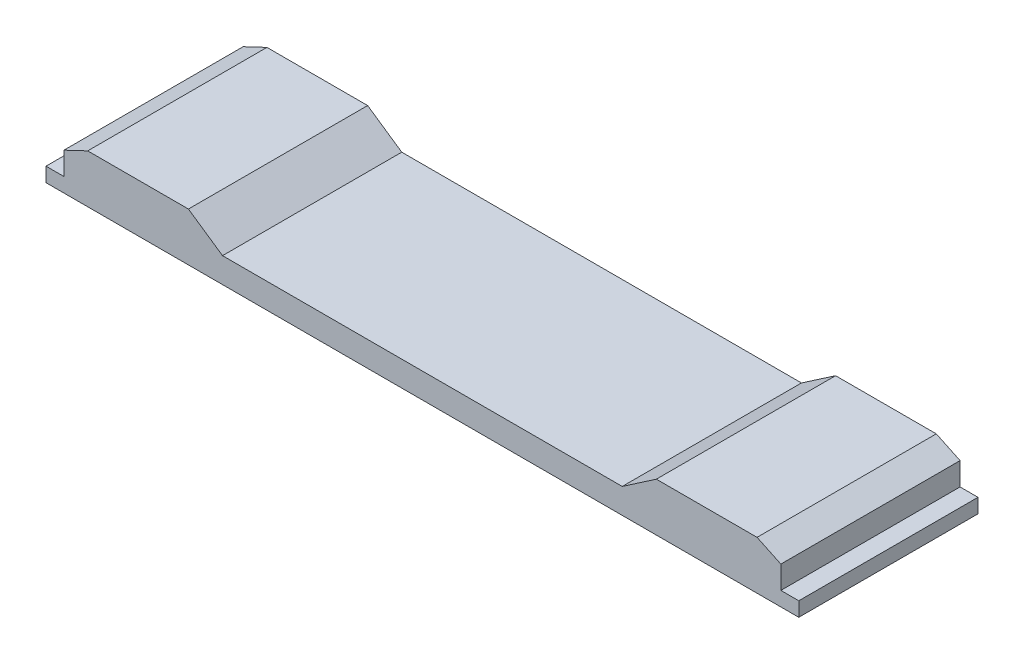
ISO-10303-21;
HEADER;
FILE_DESCRIPTION(('STEP AP214'),'2;1');
FILE_NAME('part.step','',(''),(''),'','','');
FILE_SCHEMA(('AUTOMOTIVE_DESIGN { 1 0 10303 214 1 1 1 1 }'));
ENDSEC;
DATA;
#1=APPLICATION_CONTEXT('core data for automotive mechanical design processes');
#2=APPLICATION_PROTOCOL_DEFINITION('international standard','automotive_design',2000,#1);
#3=PRODUCT_CONTEXT('',#1,'mechanical');
#4=PRODUCT('Part','Part','',(#3));
#5=PRODUCT_RELATED_PRODUCT_CATEGORY('part','',(#4));
#6=PRODUCT_DEFINITION_FORMATION('','',#4);
#7=PRODUCT_DEFINITION_CONTEXT('part definition',#1,'design');
#8=PRODUCT_DEFINITION('design','',#6,#7);
#9=PRODUCT_DEFINITION_SHAPE('','',#8);
#10=(LENGTH_UNIT() NAMED_UNIT(*) SI_UNIT(.MILLI.,.METRE.));
#11=(NAMED_UNIT(*) PLANE_ANGLE_UNIT() SI_UNIT($,.RADIAN.));
#12=(NAMED_UNIT(*) SI_UNIT($,.STERADIAN.) SOLID_ANGLE_UNIT());
#13=UNCERTAINTY_MEASURE_WITH_UNIT(LENGTH_MEASURE(1.E-05),#10,'distance_accuracy_value','');
#14=(GEOMETRIC_REPRESENTATION_CONTEXT(3) GLOBAL_UNCERTAINTY_ASSIGNED_CONTEXT((#13)) GLOBAL_UNIT_ASSIGNED_CONTEXT((#10,
#11,#12)) REPRESENTATION_CONTEXT('',''));
#15=CARTESIAN_POINT('',(0.,0.,0.));
#16=DIRECTION('',(0.,0.,1.));
#17=DIRECTION('',(1.,0.,0.));
#18=AXIS2_PLACEMENT_3D('',#15,#16,#17);
#19=CARTESIAN_POINT('',(21.,26.3300000000003,10.));
#20=DIRECTION('',(-1.,0.,0.));
#21=DIRECTION('',(0.,-1.,0.));
#22=AXIS2_PLACEMENT_3D('',#19,#20,#21);
#23=PLANE('',#22);
#24=DIRECTION('',(0.,1.,0.));
#25=VECTOR('',#24,1.);
#26=CARTESIAN_POINT('',(21.,26.3300000000003,0.));
#27=LINE('',#26,#25);
#28=CARTESIAN_POINT('',(21.,26.3300000000003,0.));
#29=VERTEX_POINT('',#28);
#30=CARTESIAN_POINT('',(21.,27.1300000000003,0.));
#31=VERTEX_POINT('',#30);
#32=EDGE_CURVE('E167',#29,#31,#27,.T.);
#33=ORIENTED_EDGE('',*,*,#32,.T.);
#34=DIRECTION('',(0.,0.,-1.));
#35=VECTOR('',#34,1.);
#36=CARTESIAN_POINT('',(21.,27.1300000000003,10.));
#37=LINE('',#36,#35);
#38=CARTESIAN_POINT('',(21.,27.1300000000003,10.));
#39=VERTEX_POINT('',#38);
#40=EDGE_CURVE('E11',#39,#31,#37,.T.);
#41=ORIENTED_EDGE('',*,*,#40,.F.);
#42=DIRECTION('',(0.,1.,0.));
#43=VECTOR('',#42,1.);
#44=CARTESIAN_POINT('',(21.,26.3300000000003,10.));
#45=LINE('',#44,#43);
#46=CARTESIAN_POINT('',(21.,26.3300000000003,10.));
#47=VERTEX_POINT('',#46);
#48=EDGE_CURVE('E194',#47,#39,#45,.T.);
#49=ORIENTED_EDGE('',*,*,#48,.F.);
#50=DIRECTION('',(0.,0.,-1.));
#51=VECTOR('',#50,1.);
#52=CARTESIAN_POINT('',(21.,26.3300000000003,10.));
#53=LINE('',#52,#51);
#54=EDGE_CURVE('E163',#47,#29,#53,.T.);
#55=ORIENTED_EDGE('',*,*,#54,.T.);
#56=EDGE_LOOP('',(#33,#41,#49,#55));
#57=FACE_BOUND('',#56,.T.);
#58=ADVANCED_FACE('F34',(#57),#23,.F.);
#59=CARTESIAN_POINT('',(20.,27.1300000000004,10.));
#60=DIRECTION('',(0.,-1.,0.));
#61=DIRECTION('',(1.,0.,0.));
#62=AXIS2_PLACEMENT_3D('',#59,#60,#61);
#63=PLANE('',#62);
#64=DIRECTION('',(-1.,0.,0.));
#65=VECTOR('',#64,1.);
#66=CARTESIAN_POINT('',(20.,27.1300000000004,0.));
#67=LINE('',#66,#65);
#68=CARTESIAN_POINT('',(20.,27.1300000000004,0.));
#69=VERTEX_POINT('',#68);
#70=EDGE_CURVE('E170',#31,#69,#67,.T.);
#71=ORIENTED_EDGE('',*,*,#70,.T.);
#72=DIRECTION('',(0.,0.,-1.));
#73=VECTOR('',#72,1.);
#74=CARTESIAN_POINT('',(20.,27.1300000000004,10.));
#75=LINE('',#74,#73);
#76=CARTESIAN_POINT('',(20.,27.1300000000004,10.));
#77=VERTEX_POINT('',#76);
#78=EDGE_CURVE('E42',#77,#69,#75,.T.);
#79=ORIENTED_EDGE('',*,*,#78,.F.);
#80=DIRECTION('',(-1.,0.,0.));
#81=VECTOR('',#80,1.);
#82=CARTESIAN_POINT('',(20.,27.1300000000004,10.));
#83=LINE('',#82,#81);
#84=EDGE_CURVE('E109',#39,#77,#83,.T.);
#85=ORIENTED_EDGE('',*,*,#84,.F.);
#86=ORIENTED_EDGE('',*,*,#40,.T.);
#87=EDGE_LOOP('',(#71,#79,#85,#86));
#88=FACE_BOUND('',#87,.T.);
#89=ADVANCED_FACE('F272',(#88),#63,.F.);
#90=CARTESIAN_POINT('',(20.,27.1300000000004,10.));
#91=DIRECTION('',(-1.,0.,0.));
#92=DIRECTION('',(0.,-1.,0.));
#93=AXIS2_PLACEMENT_3D('',#90,#91,#92);
#94=PLANE('',#93);
#95=DIRECTION('',(0.,1.,0.));
#96=VECTOR('',#95,1.);
#97=CARTESIAN_POINT('',(20.,27.1300000000004,0.));
#98=LINE('',#97,#96);
#99=CARTESIAN_POINT('',(20.,28.4029973447382,0.));
#100=VERTEX_POINT('',#99);
#101=EDGE_CURVE('E172',#69,#100,#98,.T.);
#102=ORIENTED_EDGE('',*,*,#101,.T.);
#103=DIRECTION('',(0.,0.,-1.));
#104=VECTOR('',#103,1.);
#105=CARTESIAN_POINT('',(20.,28.4029973447382,10.));
#106=LINE('',#105,#104);
#107=CARTESIAN_POINT('',(20.,28.4029973447382,10.));
#108=VERTEX_POINT('',#107);
#109=EDGE_CURVE('E219',#108,#100,#106,.T.);
#110=ORIENTED_EDGE('',*,*,#109,.F.);
#111=DIRECTION('',(0.,1.,0.));
#112=VECTOR('',#111,1.);
#113=CARTESIAN_POINT('',(20.,27.1300000000004,10.));
#114=LINE('',#113,#112);
#115=EDGE_CURVE('E227',#77,#108,#114,.T.);
#116=ORIENTED_EDGE('',*,*,#115,.F.);
#117=ORIENTED_EDGE('',*,*,#78,.T.);
#118=EDGE_LOOP('',(#102,#110,#116,#117));
#119=FACE_BOUND('',#118,.T.);
#120=ADVANCED_FACE('F225',(#119),#94,.F.);
#121=CARTESIAN_POINT('',(18.673455449261,29.0320391081246,10.));
#122=DIRECTION('',(-0.428463796767612,-0.903558949299647,0.));
#123=DIRECTION('',(0.903558949299647,-0.428463796767612,0.));
#124=AXIS2_PLACEMENT_3D('',#121,#122,#123);
#125=PLANE('',#124);
#126=DIRECTION('',(-0.903558949299647,0.428463796767612,0.));
#127=VECTOR('',#126,1.);
#128=CARTESIAN_POINT('',(18.673455449261,29.0320391081246,0.));
#129=LINE('',#128,#127);
#130=CARTESIAN_POINT('',(18.673455449261,29.0320391081246,0.));
#131=VERTEX_POINT('',#130);
#132=EDGE_CURVE('E174',#100,#131,#129,.T.);
#133=ORIENTED_EDGE('',*,*,#132,.T.);
#134=DIRECTION('',(0.,0.,-1.));
#135=VECTOR('',#134,1.);
#136=CARTESIAN_POINT('',(18.673455449261,29.0320391081246,10.));
#137=LINE('',#136,#135);
#138=CARTESIAN_POINT('',(18.673455449261,29.0320391081246,10.));
#139=VERTEX_POINT('',#138);
#140=EDGE_CURVE('E216',#139,#131,#137,.T.);
#141=ORIENTED_EDGE('',*,*,#140,.F.);
#142=DIRECTION('',(-0.903558949299647,0.428463796767612,0.));
#143=VECTOR('',#142,1.);
#144=CARTESIAN_POINT('',(18.673455449261,29.0320391081246,10.));
#145=LINE('',#144,#143);
#146=EDGE_CURVE('E243',#108,#139,#145,.T.);
#147=ORIENTED_EDGE('',*,*,#146,.F.);
#148=ORIENTED_EDGE('',*,*,#109,.T.);
#149=EDGE_LOOP('',(#133,#141,#147,#148));
#150=FACE_BOUND('',#149,.T.);
#151=ADVANCED_FACE('F234',(#150),#125,.F.);
#152=CARTESIAN_POINT('',(13.0537408112336,29.0320391081246,10.));
#153=DIRECTION('',(0.,-1.,0.));
#154=DIRECTION('',(0.,0.,-1.));
#155=AXIS2_PLACEMENT_3D('',#152,#153,#154);
#156=PLANE('',#155);
#157=DIRECTION('',(-1.,0.,0.));
#158=VECTOR('',#157,1.);
#159=CARTESIAN_POINT('',(13.0537408112336,29.0320391081246,0.));
#160=LINE('',#159,#158);
#161=CARTESIAN_POINT('',(13.0537408112336,29.0320391081246,0.));
#162=VERTEX_POINT('',#161);
#163=EDGE_CURVE('E176',#131,#162,#160,.T.);
#164=ORIENTED_EDGE('',*,*,#163,.T.);
#165=DIRECTION('',(0.,0.,-1.));
#166=VECTOR('',#165,1.);
#167=CARTESIAN_POINT('',(13.0537408112336,29.0320391081246,10.));
#168=LINE('',#167,#166);
#169=CARTESIAN_POINT('',(13.0537408112336,29.0320391081246,10.));
#170=VERTEX_POINT('',#169);
#171=EDGE_CURVE('E213',#170,#162,#168,.T.);
#172=ORIENTED_EDGE('',*,*,#171,.F.);
#173=DIRECTION('',(-1.,0.,0.));
#174=VECTOR('',#173,1.);
#175=CARTESIAN_POINT('',(13.0537408112336,29.0320391081246,10.));
#176=LINE('',#175,#174);
#177=EDGE_CURVE('E240',#139,#170,#176,.T.);
#178=ORIENTED_EDGE('',*,*,#177,.F.);
#179=ORIENTED_EDGE('',*,*,#140,.T.);
#180=EDGE_LOOP('',(#164,#172,#178,#179));
#181=FACE_BOUND('',#180,.T.);
#182=ADVANCED_FACE('F238',(#181),#156,.F.);
#183=CARTESIAN_POINT('',(11.1507605762815,27.7300000000003,10.));
#184=DIRECTION('',(0.564683915591726,-0.825307261250013,0.));
#185=DIRECTION('',(0.825307261250013,0.564683915591726,0.));
#186=AXIS2_PLACEMENT_3D('',#183,#184,#185);
#187=PLANE('',#186);
#188=DIRECTION('',(-0.825307261250013,-0.564683915591726,0.));
#189=VECTOR('',#188,1.);
#190=CARTESIAN_POINT('',(11.1507605762815,27.7300000000003,0.));
#191=LINE('',#190,#189);
#192=CARTESIAN_POINT('',(11.1507605762815,27.7300000000003,0.));
#193=VERTEX_POINT('',#192);
#194=EDGE_CURVE('E178',#162,#193,#191,.T.);
#195=ORIENTED_EDGE('',*,*,#194,.T.);
#196=DIRECTION('',(0.,0.,-1.));
#197=VECTOR('',#196,1.);
#198=CARTESIAN_POINT('',(11.1507605762815,27.7300000000003,10.));
#199=LINE('',#198,#197);
#200=CARTESIAN_POINT('',(11.1507605762815,27.7300000000003,10.));
#201=VERTEX_POINT('',#200);
#202=EDGE_CURVE('E210',#201,#193,#199,.T.);
#203=ORIENTED_EDGE('',*,*,#202,.F.);
#204=DIRECTION('',(-0.825307261250013,-0.564683915591726,0.));
#205=VECTOR('',#204,1.);
#206=CARTESIAN_POINT('',(11.1507605762815,27.7300000000003,10.));
#207=LINE('',#206,#205);
#208=EDGE_CURVE('E242',#170,#201,#207,.T.);
#209=ORIENTED_EDGE('',*,*,#208,.F.);
#210=ORIENTED_EDGE('',*,*,#171,.T.);
#211=EDGE_LOOP('',(#195,#203,#209,#210));
#212=FACE_BOUND('',#211,.T.);
#213=ADVANCED_FACE('F284',(#212),#187,.F.);
#214=CARTESIAN_POINT('',(-11.1507605762815,27.7300000000003,10.));
#215=DIRECTION('',(0.,-1.,0.));
#216=DIRECTION('',(0.,0.,-1.));
#217=AXIS2_PLACEMENT_3D('',#214,#215,#216);
#218=PLANE('',#217);
#219=DIRECTION('',(-1.,0.,0.));
#220=VECTOR('',#219,1.);
#221=CARTESIAN_POINT('',(-11.1507605762815,27.7300000000003,0.));
#222=LINE('',#221,#220);
#223=CARTESIAN_POINT('',(-11.1507605762815,27.7300000000003,0.));
#224=VERTEX_POINT('',#223);
#225=EDGE_CURVE('E180',#193,#224,#222,.T.);
#226=ORIENTED_EDGE('',*,*,#225,.T.);
#227=DIRECTION('',(0.,0.,-1.));
#228=VECTOR('',#227,1.);
#229=CARTESIAN_POINT('',(-11.1507605762815,27.7300000000003,10.));
#230=LINE('',#229,#228);
#231=CARTESIAN_POINT('',(-11.1507605762815,27.7300000000003,10.));
#232=VERTEX_POINT('',#231);
#233=EDGE_CURVE('E207',#232,#224,#230,.T.);
#234=ORIENTED_EDGE('',*,*,#233,.F.);
#235=DIRECTION('',(-1.,0.,0.));
#236=VECTOR('',#235,1.);
#237=CARTESIAN_POINT('',(-11.1507605762815,27.7300000000003,10.));
#238=LINE('',#237,#236);
#239=EDGE_CURVE('E245',#201,#232,#238,.T.);
#240=ORIENTED_EDGE('',*,*,#239,.F.);
#241=ORIENTED_EDGE('',*,*,#202,.T.);
#242=EDGE_LOOP('',(#226,#234,#240,#241));
#243=FACE_BOUND('',#242,.T.);
#244=ADVANCED_FACE('F287',(#243),#218,.F.);
#245=CARTESIAN_POINT('',(-13.0537408112336,29.0320391081246,10.));
#246=DIRECTION('',(-0.564683915591738,-0.825307261250004,0.));
#247=DIRECTION('',(0.825307261250004,-0.564683915591738,0.));
#248=AXIS2_PLACEMENT_3D('',#245,#246,#247);
#249=PLANE('',#248);
#250=DIRECTION('',(-0.825307261250004,0.564683915591738,0.));
#251=VECTOR('',#250,1.);
#252=CARTESIAN_POINT('',(-13.0537408112336,29.0320391081246,0.));
#253=LINE('',#252,#251);
#254=CARTESIAN_POINT('',(-13.0537408112336,29.0320391081246,0.));
#255=VERTEX_POINT('',#254);
#256=EDGE_CURVE('E182',#224,#255,#253,.T.);
#257=ORIENTED_EDGE('',*,*,#256,.T.);
#258=DIRECTION('',(0.,0.,-1.));
#259=VECTOR('',#258,1.);
#260=CARTESIAN_POINT('',(-13.0537408112336,29.0320391081246,10.));
#261=LINE('',#260,#259);
#262=CARTESIAN_POINT('',(-13.0537408112336,29.0320391081246,10.));
#263=VERTEX_POINT('',#262);
#264=EDGE_CURVE('E204',#263,#255,#261,.T.);
#265=ORIENTED_EDGE('',*,*,#264,.F.);
#266=DIRECTION('',(-0.825307261250004,0.564683915591738,0.));
#267=VECTOR('',#266,1.);
#268=CARTESIAN_POINT('',(-13.0537408112336,29.0320391081246,10.));
#269=LINE('',#268,#267);
#270=EDGE_CURVE('E251',#232,#263,#269,.T.);
#271=ORIENTED_EDGE('',*,*,#270,.F.);
#272=ORIENTED_EDGE('',*,*,#233,.T.);
#273=EDGE_LOOP('',(#257,#265,#271,#272));
#274=FACE_BOUND('',#273,.T.);
#275=ADVANCED_FACE('F291',(#274),#249,.F.);
#276=CARTESIAN_POINT('',(-18.673455449261,29.0320391081246,10.));
#277=DIRECTION('',(0.,-1.,0.));
#278=DIRECTION('',(0.,0.,-1.));
#279=AXIS2_PLACEMENT_3D('',#276,#277,#278);
#280=PLANE('',#279);
#281=DIRECTION('',(-1.,0.,0.));
#282=VECTOR('',#281,1.);
#283=CARTESIAN_POINT('',(-18.673455449261,29.0320391081246,0.));
#284=LINE('',#283,#282);
#285=CARTESIAN_POINT('',(-18.673455449261,29.0320391081246,0.));
#286=VERTEX_POINT('',#285);
#287=EDGE_CURVE('E184',#255,#286,#284,.T.);
#288=ORIENTED_EDGE('',*,*,#287,.T.);
#289=DIRECTION('',(0.,0.,-1.));
#290=VECTOR('',#289,1.);
#291=CARTESIAN_POINT('',(-18.673455449261,29.0320391081246,10.));
#292=LINE('',#291,#290);
#293=CARTESIAN_POINT('',(-18.673455449261,29.0320391081246,10.));
#294=VERTEX_POINT('',#293);
#295=EDGE_CURVE('E201',#294,#286,#292,.T.);
#296=ORIENTED_EDGE('',*,*,#295,.F.);
#297=DIRECTION('',(-1.,0.,0.));
#298=VECTOR('',#297,1.);
#299=CARTESIAN_POINT('',(-18.673455449261,29.0320391081246,10.));
#300=LINE('',#299,#298);
#301=EDGE_CURVE('E253',#263,#294,#300,.T.);
#302=ORIENTED_EDGE('',*,*,#301,.F.);
#303=ORIENTED_EDGE('',*,*,#264,.T.);
#304=EDGE_LOOP('',(#288,#296,#302,#303));
#305=FACE_BOUND('',#304,.T.);
#306=ADVANCED_FACE('F295',(#305),#280,.F.);
#307=CARTESIAN_POINT('',(-20.,28.4029973447382,10.));
#308=DIRECTION('',(0.428463796767622,-0.903558949299642,0.));
#309=DIRECTION('',(0.903558949299642,0.428463796767622,0.));
#310=AXIS2_PLACEMENT_3D('',#307,#308,#309);
#311=PLANE('',#310);
#312=DIRECTION('',(-0.903558949299642,-0.428463796767623,0.));
#313=VECTOR('',#312,1.);
#314=CARTESIAN_POINT('',(-20.,28.4029973447382,0.));
#315=LINE('',#314,#313);
#316=CARTESIAN_POINT('',(-20.,28.4029973447382,0.));
#317=VERTEX_POINT('',#316);
#318=EDGE_CURVE('E186',#286,#317,#315,.T.);
#319=ORIENTED_EDGE('',*,*,#318,.T.);
#320=DIRECTION('',(0.,0.,-1.));
#321=VECTOR('',#320,1.);
#322=CARTESIAN_POINT('',(-20.,28.4029973447382,10.));
#323=LINE('',#322,#321);
#324=CARTESIAN_POINT('',(-20.,28.4029973447382,10.));
#325=VERTEX_POINT('',#324);
#326=EDGE_CURVE('E198',#325,#317,#323,.T.);
#327=ORIENTED_EDGE('',*,*,#326,.F.);
#328=DIRECTION('',(-0.903558949299642,-0.428463796767623,0.));
#329=VECTOR('',#328,1.);
#330=CARTESIAN_POINT('',(-20.,28.4029973447382,10.));
#331=LINE('',#330,#329);
#332=EDGE_CURVE('E255',#294,#325,#331,.T.);
#333=ORIENTED_EDGE('',*,*,#332,.F.);
#334=ORIENTED_EDGE('',*,*,#295,.T.);
#335=EDGE_LOOP('',(#319,#327,#333,#334));
#336=FACE_BOUND('',#335,.T.);
#337=ADVANCED_FACE('F261',(#336),#311,.F.);
#338=CARTESIAN_POINT('',(-20.,27.13,10.));
#339=DIRECTION('',(1.,0.,0.));
#340=DIRECTION('',(0.,0.,-1.));
#341=AXIS2_PLACEMENT_3D('',#338,#339,#340);
#342=PLANE('',#341);
#343=DIRECTION('',(0.,-1.,0.));
#344=VECTOR('',#343,1.);
#345=CARTESIAN_POINT('',(-20.,27.13,0.));
#346=LINE('',#345,#344);
#347=CARTESIAN_POINT('',(-20.,27.13,0.));
#348=VERTEX_POINT('',#347);
#349=EDGE_CURVE('E188',#317,#348,#346,.T.);
#350=ORIENTED_EDGE('',*,*,#349,.T.);
#351=DIRECTION('',(0.,0.,-1.));
#352=VECTOR('',#351,1.);
#353=CARTESIAN_POINT('',(-20.,27.13,10.));
#354=LINE('',#353,#352);
#355=CARTESIAN_POINT('',(-20.,27.13,10.));
#356=VERTEX_POINT('',#355);
#357=EDGE_CURVE('E158',#356,#348,#354,.T.);
#358=ORIENTED_EDGE('',*,*,#357,.F.);
#359=DIRECTION('',(0.,-1.,0.));
#360=VECTOR('',#359,1.);
#361=CARTESIAN_POINT('',(-20.,27.13,10.));
#362=LINE('',#361,#360);
#363=EDGE_CURVE('E147',#325,#356,#362,.T.);
#364=ORIENTED_EDGE('',*,*,#363,.F.);
#365=ORIENTED_EDGE('',*,*,#326,.T.);
#366=EDGE_LOOP('',(#350,#358,#364,#365));
#367=FACE_BOUND('',#366,.T.);
#368=ADVANCED_FACE('F265',(#367),#342,.F.);
#369=CARTESIAN_POINT('',(-20.,27.13,10.));
#370=DIRECTION('',(-3.36536354339497E-13,-1.,0.));
#371=DIRECTION('',(1.,-3.36536354339497E-13,0.));
#372=AXIS2_PLACEMENT_3D('',#369,#370,#371);
#373=PLANE('',#372);
#374=DIRECTION('',(-1.,3.36536354339497E-13,0.));
#375=VECTOR('',#374,1.);
#376=CARTESIAN_POINT('',(-20.,27.13,0.));
#377=LINE('',#376,#375);
#378=CARTESIAN_POINT('',(-21.,27.1300000000003,0.));
#379=VERTEX_POINT('',#378);
#380=EDGE_CURVE('E156',#348,#379,#377,.T.);
#381=ORIENTED_EDGE('',*,*,#380,.T.);
#382=DIRECTION('',(0.,0.,-1.));
#383=VECTOR('',#382,1.);
#384=CARTESIAN_POINT('',(-21.,27.1300000000003,10.));
#385=LINE('',#384,#383);
#386=CARTESIAN_POINT('',(-21.,27.1300000000003,10.));
#387=VERTEX_POINT('',#386);
#388=EDGE_CURVE('E153',#387,#379,#385,.T.);
#389=ORIENTED_EDGE('',*,*,#388,.F.);
#390=DIRECTION('',(-1.,3.36536354339497E-13,0.));
#391=VECTOR('',#390,1.);
#392=CARTESIAN_POINT('',(-20.,27.13,10.));
#393=LINE('',#392,#391);
#394=EDGE_CURVE('E140',#356,#387,#393,.T.);
#395=ORIENTED_EDGE('',*,*,#394,.F.);
#396=ORIENTED_EDGE('',*,*,#357,.T.);
#397=EDGE_LOOP('',(#381,#389,#395,#396));
#398=FACE_BOUND('',#397,.T.);
#399=ADVANCED_FACE('F154',(#398),#373,.F.);
#400=CARTESIAN_POINT('',(-21.,26.3300000000003,10.));
#401=DIRECTION('',(1.,0.,0.));
#402=DIRECTION('',(0.,1.,0.));
#403=AXIS2_PLACEMENT_3D('',#400,#401,#402);
#404=PLANE('',#403);
#405=DIRECTION('',(0.,-1.,0.));
#406=VECTOR('',#405,1.);
#407=CARTESIAN_POINT('',(-21.,26.3300000000003,0.));
#408=LINE('',#407,#406);
#409=CARTESIAN_POINT('',(-21.,26.3300000000003,0.));
#410=VERTEX_POINT('',#409);
#411=EDGE_CURVE('E191',#379,#410,#408,.T.);
#412=ORIENTED_EDGE('',*,*,#411,.T.);
#413=DIRECTION('',(0.,0.,-1.));
#414=VECTOR('',#413,1.);
#415=CARTESIAN_POINT('',(-21.,26.3300000000003,10.));
#416=LINE('',#415,#414);
#417=CARTESIAN_POINT('',(-21.,26.3300000000003,10.));
#418=VERTEX_POINT('',#417);
#419=EDGE_CURVE('E159',#418,#410,#416,.T.);
#420=ORIENTED_EDGE('',*,*,#419,.F.);
#421=DIRECTION('',(0.,-1.,0.));
#422=VECTOR('',#421,1.);
#423=CARTESIAN_POINT('',(-21.,26.3300000000003,10.));
#424=LINE('',#423,#422);
#425=EDGE_CURVE('E144',#387,#418,#424,.T.);
#426=ORIENTED_EDGE('',*,*,#425,.F.);
#427=ORIENTED_EDGE('',*,*,#388,.T.);
#428=EDGE_LOOP('',(#412,#420,#426,#427));
#429=FACE_BOUND('',#428,.T.);
#430=ADVANCED_FACE('F161',(#429),#404,.F.);
#431=CARTESIAN_POINT('',(20.,26.3300000000004,10.));
#432=DIRECTION('',(0.,1.,0.));
#433=DIRECTION('',(-1.,0.,0.));
#434=AXIS2_PLACEMENT_3D('',#431,#432,#433);
#435=PLANE('',#434);
#436=DIRECTION('',(1.,0.,0.));
#437=VECTOR('',#436,1.);
#438=CARTESIAN_POINT('',(20.,26.3300000000004,0.));
#439=LINE('',#438,#437);
#440=EDGE_CURVE('E97',#410,#29,#439,.T.);
#441=ORIENTED_EDGE('',*,*,#440,.T.);
#442=ORIENTED_EDGE('',*,*,#54,.F.);
#443=DIRECTION('',(1.,0.,0.));
#444=VECTOR('',#443,1.);
#445=CARTESIAN_POINT('',(-20.,26.3300000000004,10.));
#446=LINE('',#445,#444);
#447=EDGE_CURVE('E50',#418,#47,#446,.T.);
#448=ORIENTED_EDGE('',*,*,#447,.F.);
#449=ORIENTED_EDGE('',*,*,#419,.T.);
#450=EDGE_LOOP('',(#441,#442,#448,#449));
#451=FACE_BOUND('',#450,.T.);
#452=ADVANCED_FACE('F266',(#451),#435,.F.);
#453=CARTESIAN_POINT('',(0.,0.,10.));
#454=DIRECTION('',(0.,0.,-1.));
#455=DIRECTION('',(-1.,0.,0.));
#456=AXIS2_PLACEMENT_3D('',#453,#454,#455);
#457=PLANE('',#456);
#458=ORIENTED_EDGE('',*,*,#48,.T.);
#459=ORIENTED_EDGE('',*,*,#84,.T.);
#460=ORIENTED_EDGE('',*,*,#115,.T.);
#461=ORIENTED_EDGE('',*,*,#146,.T.);
#462=ORIENTED_EDGE('',*,*,#177,.T.);
#463=ORIENTED_EDGE('',*,*,#208,.T.);
#464=ORIENTED_EDGE('',*,*,#239,.T.);
#465=ORIENTED_EDGE('',*,*,#270,.T.);
#466=ORIENTED_EDGE('',*,*,#301,.T.);
#467=ORIENTED_EDGE('',*,*,#332,.T.);
#468=ORIENTED_EDGE('',*,*,#363,.T.);
#469=ORIENTED_EDGE('',*,*,#394,.T.);
#470=ORIENTED_EDGE('',*,*,#425,.T.);
#471=ORIENTED_EDGE('',*,*,#447,.T.);
#472=EDGE_LOOP('',(#458,#459,#460,#461,#462,#463,#464,#465,#466,#467,#468,#469,#470,#471));
#473=FACE_BOUND('',#472,.T.);
#474=ADVANCED_FACE('F142',(#473),#457,.F.);
#475=CARTESIAN_POINT('',(0.,0.,0.));
#476=DIRECTION('',(0.,0.,-1.));
#477=DIRECTION('',(-1.,0.,0.));
#478=AXIS2_PLACEMENT_3D('',#475,#476,#477);
#479=PLANE('',#478);
#480=ORIENTED_EDGE('',*,*,#32,.F.);
#481=ORIENTED_EDGE('',*,*,#440,.F.);
#482=ORIENTED_EDGE('',*,*,#411,.F.);
#483=ORIENTED_EDGE('',*,*,#380,.F.);
#484=ORIENTED_EDGE('',*,*,#349,.F.);
#485=ORIENTED_EDGE('',*,*,#318,.F.);
#486=ORIENTED_EDGE('',*,*,#287,.F.);
#487=ORIENTED_EDGE('',*,*,#256,.F.);
#488=ORIENTED_EDGE('',*,*,#225,.F.);
#489=ORIENTED_EDGE('',*,*,#194,.F.);
#490=ORIENTED_EDGE('',*,*,#163,.F.);
#491=ORIENTED_EDGE('',*,*,#132,.F.);
#492=ORIENTED_EDGE('',*,*,#101,.F.);
#493=ORIENTED_EDGE('',*,*,#70,.F.);
#494=EDGE_LOOP('',(#480,#481,#482,#483,#484,#485,#486,#487,#488,#489,#490,#491,#492,#493));
#495=FACE_BOUND('',#494,.T.);
#496=ADVANCED_FACE('F229',(#495),#479,.T.);
#497=CLOSED_SHELL('',(#58,#89,#120,#151,#182,#213,#244,#275,#306,#337,#368,#399,#430,#452,#474,#496));
#498=MANIFOLD_SOLID_BREP('B2',#497);
#499=ADVANCED_BREP_SHAPE_REPRESENTATION('',(#18,#498),#14);
#500=SHAPE_DEFINITION_REPRESENTATION(#9,#499);
ENDSEC;
END-ISO-10303-21;
